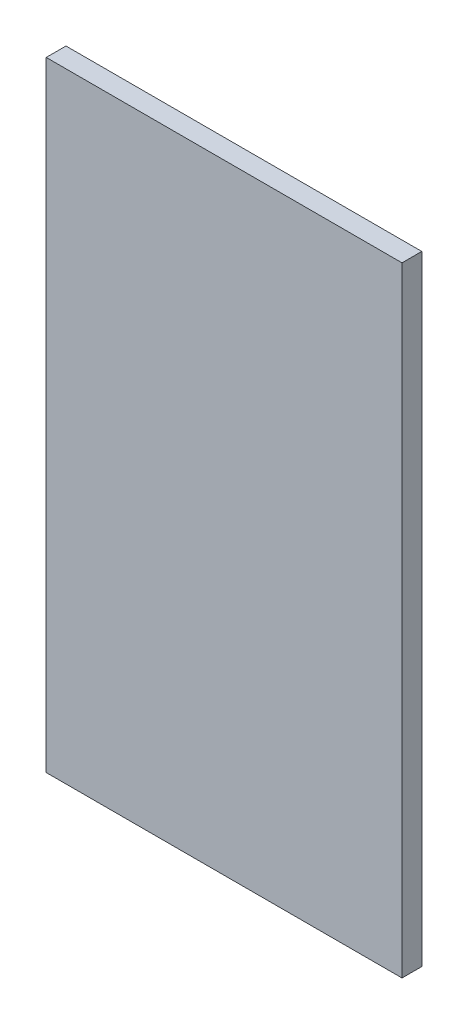
ISO-10303-21;
HEADER;
FILE_DESCRIPTION(('STEP AP214'),'2;1');
FILE_NAME('part.step','',(''),(''),'','','');
FILE_SCHEMA(('AUTOMOTIVE_DESIGN { 1 0 10303 214 1 1 1 1 }'));
ENDSEC;
DATA;
#1=APPLICATION_CONTEXT('core data for automotive mechanical design processes');
#2=APPLICATION_PROTOCOL_DEFINITION('international standard','automotive_design',2000,#1);
#3=PRODUCT_CONTEXT('',#1,'mechanical');
#4=PRODUCT('Part','Part','',(#3));
#5=PRODUCT_RELATED_PRODUCT_CATEGORY('part','',(#4));
#6=PRODUCT_DEFINITION_FORMATION('','',#4);
#7=PRODUCT_DEFINITION_CONTEXT('part definition',#1,'design');
#8=PRODUCT_DEFINITION('design','',#6,#7);
#9=PRODUCT_DEFINITION_SHAPE('','',#8);
#10=(LENGTH_UNIT() NAMED_UNIT(*) SI_UNIT(.MILLI.,.METRE.));
#11=(NAMED_UNIT(*) PLANE_ANGLE_UNIT() SI_UNIT($,.RADIAN.));
#12=(NAMED_UNIT(*) SI_UNIT($,.STERADIAN.) SOLID_ANGLE_UNIT());
#13=UNCERTAINTY_MEASURE_WITH_UNIT(LENGTH_MEASURE(1.E-05),#10,'distance_accuracy_value','');
#14=(GEOMETRIC_REPRESENTATION_CONTEXT(3) GLOBAL_UNCERTAINTY_ASSIGNED_CONTEXT((#13)) GLOBAL_UNIT_ASSIGNED_CONTEXT((#10,
#11,#12)) REPRESENTATION_CONTEXT('',''));
#15=CARTESIAN_POINT('',(0.,0.,0.));
#16=DIRECTION('',(0.,0.,1.));
#17=DIRECTION('',(1.,0.,0.));
#18=AXIS2_PLACEMENT_3D('',#15,#16,#17);
#19=CARTESIAN_POINT('',(-3.49720252756924E-12,-235.000000000014,240.));
#20=DIRECTION('',(1.,0.,0.));
#21=DIRECTION('',(0.,0.,1.));
#22=AXIS2_PLACEMENT_3D('',#19,#20,#21);
#23=PLANE('',#22);
#24=DIRECTION('',(0.,1.,0.));
#25=VECTOR('',#24,1.);
#26=CARTESIAN_POINT('',(-3.49720252756924E-12,-235.000000000014,225.));
#27=LINE('',#26,#25);
#28=CARTESIAN_POINT('',(-3.49720252756924E-12,-235.000000000014,225.));
#29=VERTEX_POINT('',#28);
#30=CARTESIAN_POINT('',(-3.49720252756924E-12,235.,225.));
#31=VERTEX_POINT('',#30);
#32=EDGE_CURVE('E96',#29,#31,#27,.T.);
#33=ORIENTED_EDGE('',*,*,#32,.F.);
#34=DIRECTION('',(0.,0.,-1.));
#35=VECTOR('',#34,1.);
#36=CARTESIAN_POINT('',(-3.49720252756924E-12,-235.000000000014,240.));
#37=LINE('',#36,#35);
#38=CARTESIAN_POINT('',(-3.49720252756924E-12,-235.000000000014,240.));
#39=VERTEX_POINT('',#38);
#40=EDGE_CURVE('E95',#39,#29,#37,.T.);
#41=ORIENTED_EDGE('',*,*,#40,.F.);
#42=DIRECTION('',(0.,1.,0.));
#43=VECTOR('',#42,1.);
#44=CARTESIAN_POINT('',(-3.49720252756924E-12,-235.000000000014,240.));
#45=LINE('',#44,#43);
#46=CARTESIAN_POINT('',(-3.49720252756924E-12,235.,240.));
#47=VERTEX_POINT('',#46);
#48=EDGE_CURVE('E90',#39,#47,#45,.T.);
#49=ORIENTED_EDGE('',*,*,#48,.T.);
#50=DIRECTION('',(0.,0.,-1.));
#51=VECTOR('',#50,1.);
#52=CARTESIAN_POINT('',(-3.49720252756924E-12,235.,240.));
#53=LINE('',#52,#51);
#54=EDGE_CURVE('E11',#47,#31,#53,.T.);
#55=ORIENTED_EDGE('',*,*,#54,.T.);
#56=EDGE_LOOP('',(#33,#41,#49,#55));
#57=FACE_BOUND('',#56,.T.);
#58=ADVANCED_FACE('F33',(#57),#23,.F.);
#59=CARTESIAN_POINT('',(-3.49720252756924E-12,235.,240.));
#60=DIRECTION('',(0.,-1.,0.));
#61=DIRECTION('',(-1.,0.,0.));
#62=AXIS2_PLACEMENT_3D('',#59,#60,#61);
#63=PLANE('',#62);
#64=DIRECTION('',(1.,0.,0.));
#65=VECTOR('',#64,1.);
#66=CARTESIAN_POINT('',(-3.49720252756924E-12,235.,225.));
#67=LINE('',#66,#65);
#68=CARTESIAN_POINT('',(270.,235.,225.));
#69=VERTEX_POINT('',#68);
#70=EDGE_CURVE('E98',#31,#69,#67,.T.);
#71=ORIENTED_EDGE('',*,*,#70,.F.);
#72=ORIENTED_EDGE('',*,*,#54,.F.);
#73=DIRECTION('',(1.,0.,0.));
#74=VECTOR('',#73,1.);
#75=CARTESIAN_POINT('',(-3.49720252756924E-12,235.,240.));
#76=LINE('',#75,#74);
#77=CARTESIAN_POINT('',(270.,235.,240.));
#78=VERTEX_POINT('',#77);
#79=EDGE_CURVE('E74',#47,#78,#76,.T.);
#80=ORIENTED_EDGE('',*,*,#79,.T.);
#81=DIRECTION('',(0.,0.,-1.));
#82=VECTOR('',#81,1.);
#83=CARTESIAN_POINT('',(270.,235.,240.));
#84=LINE('',#83,#82);
#85=EDGE_CURVE('E41',#78,#69,#84,.T.);
#86=ORIENTED_EDGE('',*,*,#85,.T.);
#87=EDGE_LOOP('',(#71,#72,#80,#86));
#88=FACE_BOUND('',#87,.T.);
#89=ADVANCED_FACE('F88',(#88),#63,.F.);
#90=CARTESIAN_POINT('',(270.,-235.,240.));
#91=DIRECTION('',(-1.,0.,0.));
#92=DIRECTION('',(0.,0.,-1.));
#93=AXIS2_PLACEMENT_3D('',#90,#91,#92);
#94=PLANE('',#93);
#95=DIRECTION('',(0.,-1.,0.));
#96=VECTOR('',#95,1.);
#97=CARTESIAN_POINT('',(270.,-235.,225.));
#98=LINE('',#97,#96);
#99=CARTESIAN_POINT('',(270.,-235.,225.));
#100=VERTEX_POINT('',#99);
#101=EDGE_CURVE('E84',#69,#100,#98,.T.);
#102=ORIENTED_EDGE('',*,*,#101,.F.);
#103=ORIENTED_EDGE('',*,*,#85,.F.);
#104=DIRECTION('',(0.,-1.,0.));
#105=VECTOR('',#104,1.);
#106=CARTESIAN_POINT('',(270.,-235.,240.));
#107=LINE('',#106,#105);
#108=CARTESIAN_POINT('',(270.,-235.,240.));
#109=VERTEX_POINT('',#108);
#110=EDGE_CURVE('E77',#78,#109,#107,.T.);
#111=ORIENTED_EDGE('',*,*,#110,.T.);
#112=DIRECTION('',(0.,0.,-1.));
#113=VECTOR('',#112,1.);
#114=CARTESIAN_POINT('',(270.,-235.,240.));
#115=LINE('',#114,#113);
#116=EDGE_CURVE('E87',#109,#100,#115,.T.);
#117=ORIENTED_EDGE('',*,*,#116,.T.);
#118=EDGE_LOOP('',(#102,#103,#111,#117));
#119=FACE_BOUND('',#118,.T.);
#120=ADVANCED_FACE('F83',(#119),#94,.F.);
#121=CARTESIAN_POINT('',(-3.49720252756924E-12,-235.000000000014,240.));
#122=DIRECTION('',(0.,1.,0.));
#123=DIRECTION('',(1.,0.,0.));
#124=AXIS2_PLACEMENT_3D('',#121,#122,#123);
#125=PLANE('',#124);
#126=DIRECTION('',(-1.,0.,0.));
#127=VECTOR('',#126,1.);
#128=CARTESIAN_POINT('',(-3.49720252756924E-12,-235.000000000014,225.));
#129=LINE('',#128,#127);
#130=EDGE_CURVE('E63',#100,#29,#129,.T.);
#131=ORIENTED_EDGE('',*,*,#130,.F.);
#132=ORIENTED_EDGE('',*,*,#116,.F.);
#133=DIRECTION('',(-1.,0.,0.));
#134=VECTOR('',#133,1.);
#135=CARTESIAN_POINT('',(-3.49720252756924E-12,-235.000000000014,240.));
#136=LINE('',#135,#134);
#137=EDGE_CURVE('E49',#109,#39,#136,.T.);
#138=ORIENTED_EDGE('',*,*,#137,.T.);
#139=ORIENTED_EDGE('',*,*,#40,.T.);
#140=EDGE_LOOP('',(#131,#132,#138,#139));
#141=FACE_BOUND('',#140,.T.);
#142=ADVANCED_FACE('F107',(#141),#125,.F.);
#143=CARTESIAN_POINT('',(0.,0.,240.));
#144=DIRECTION('',(0.,0.,1.));
#145=DIRECTION('',(-1.,0.,0.));
#146=AXIS2_PLACEMENT_3D('',#143,#144,#145);
#147=PLANE('',#146);
#148=ORIENTED_EDGE('',*,*,#48,.F.);
#149=ORIENTED_EDGE('',*,*,#137,.F.);
#150=ORIENTED_EDGE('',*,*,#110,.F.);
#151=ORIENTED_EDGE('',*,*,#79,.F.);
#152=EDGE_LOOP('',(#148,#149,#150,#151));
#153=FACE_BOUND('',#152,.T.);
#154=ADVANCED_FACE('F79',(#153),#147,.T.);
#155=CARTESIAN_POINT('',(0.,0.,225.));
#156=DIRECTION('',(0.,0.,1.));
#157=DIRECTION('',(-1.,0.,0.));
#158=AXIS2_PLACEMENT_3D('',#155,#156,#157);
#159=PLANE('',#158);
#160=ORIENTED_EDGE('',*,*,#32,.T.);
#161=ORIENTED_EDGE('',*,*,#70,.T.);
#162=ORIENTED_EDGE('',*,*,#101,.T.);
#163=ORIENTED_EDGE('',*,*,#130,.T.);
#164=EDGE_LOOP('',(#160,#161,#162,#163));
#165=FACE_BOUND('',#164,.T.);
#166=ADVANCED_FACE('F103',(#165),#159,.F.);
#167=CLOSED_SHELL('',(#58,#89,#120,#142,#154,#166));
#168=MANIFOLD_SOLID_BREP('B2',#167);
#169=ADVANCED_BREP_SHAPE_REPRESENTATION('',(#18,#168),#14);
#170=SHAPE_DEFINITION_REPRESENTATION(#9,#169);
ENDSEC;
END-ISO-10303-21;
